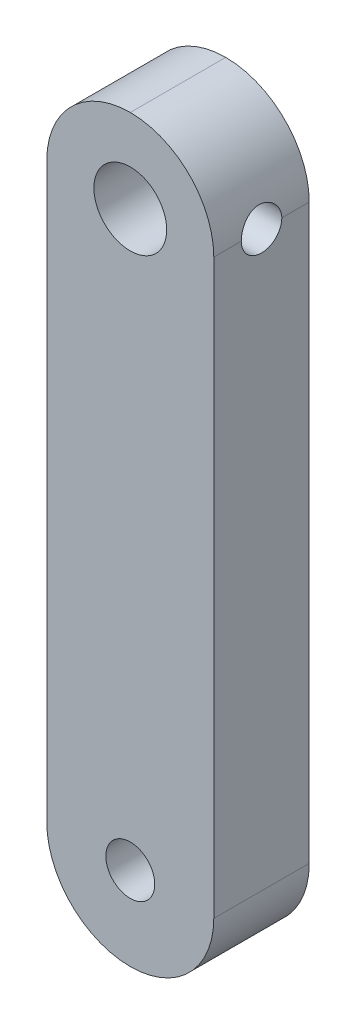
ISO-10303-21;
HEADER;
FILE_DESCRIPTION(('STEP AP214'),'2;1');
FILE_NAME('part.step','',(''),(''),'','','');
FILE_SCHEMA(('AUTOMOTIVE_DESIGN { 1 0 10303 214 1 1 1 1 }'));
ENDSEC;
DATA;
#1=APPLICATION_CONTEXT('core data for automotive mechanical design processes');
#2=APPLICATION_PROTOCOL_DEFINITION('international standard','automotive_design',2000,#1);
#3=PRODUCT_CONTEXT('',#1,'mechanical');
#4=PRODUCT('Part','Part','',(#3));
#5=PRODUCT_RELATED_PRODUCT_CATEGORY('part','',(#4));
#6=PRODUCT_DEFINITION_FORMATION('','',#4);
#7=PRODUCT_DEFINITION_CONTEXT('part definition',#1,'design');
#8=PRODUCT_DEFINITION('design','',#6,#7);
#9=PRODUCT_DEFINITION_SHAPE('','',#8);
#10=(LENGTH_UNIT() NAMED_UNIT(*) SI_UNIT(.MILLI.,.METRE.));
#11=(NAMED_UNIT(*) PLANE_ANGLE_UNIT() SI_UNIT($,.RADIAN.));
#12=(NAMED_UNIT(*) SI_UNIT($,.STERADIAN.) SOLID_ANGLE_UNIT());
#13=UNCERTAINTY_MEASURE_WITH_UNIT(LENGTH_MEASURE(1.E-05),#10,'distance_accuracy_value','');
#14=(GEOMETRIC_REPRESENTATION_CONTEXT(3) GLOBAL_UNCERTAINTY_ASSIGNED_CONTEXT((#13)) GLOBAL_UNIT_ASSIGNED_CONTEXT((#10,
#11,#12)) REPRESENTATION_CONTEXT('',''));
#15=CARTESIAN_POINT('',(0.,0.,0.));
#16=DIRECTION('',(0.,0.,1.));
#17=DIRECTION('',(1.,0.,0.));
#18=AXIS2_PLACEMENT_3D('',#15,#16,#17);
#19=CARTESIAN_POINT('',(0.,0.,8.));
#20=DIRECTION('',(1.,0.,0.));
#21=DIRECTION('',(0.,0.,-1.));
#22=AXIS2_PLACEMENT_3D('',#19,#20,#21);
#23=PLANE('',#22);
#24=DIRECTION('',(0.,-1.,0.));
#25=VECTOR('',#24,1.);
#26=CARTESIAN_POINT('',(0.,0.,0.));
#27=LINE('',#26,#25);
#28=CARTESIAN_POINT('',(0.,55.,0.));
#29=VERTEX_POINT('',#28);
#30=CARTESIAN_POINT('',(0.,7.,0.));
#31=VERTEX_POINT('',#30);
#32=EDGE_CURVE('E206',#29,#31,#27,.T.);
#33=ORIENTED_EDGE('',*,*,#32,.T.);
#34=DIRECTION('',(0.,0.,-1.));
#35=VECTOR('',#34,1.);
#36=CARTESIAN_POINT('',(0.,7.,8.));
#37=LINE('',#36,#35);
#38=CARTESIAN_POINT('',(0.,7.,8.));
#39=VERTEX_POINT('',#38);
#40=EDGE_CURVE('E11',#31,#39,#37,.F.);
#41=ORIENTED_EDGE('',*,*,#40,.T.);
#42=DIRECTION('',(0.,-1.,0.));
#43=VECTOR('',#42,1.);
#44=CARTESIAN_POINT('',(0.,0.,8.));
#45=LINE('',#44,#43);
#46=CARTESIAN_POINT('',(0.,55.,8.));
#47=VERTEX_POINT('',#46);
#48=EDGE_CURVE('E110',#47,#39,#45,.T.);
#49=ORIENTED_EDGE('',*,*,#48,.F.);
#50=DIRECTION('',(0.,0.,-1.));
#51=VECTOR('',#50,1.);
#52=CARTESIAN_POINT('',(0.,55.,8.));
#53=LINE('',#52,#51);
#54=EDGE_CURVE('E42',#47,#29,#53,.T.);
#55=ORIENTED_EDGE('',*,*,#54,.T.);
#56=EDGE_LOOP('',(#33,#41,#49,#55));
#57=FACE_BOUND('',#56,.T.);
#58=ADVANCED_FACE('F33',(#57),#23,.F.);
#59=CARTESIAN_POINT('',(14.,0.,8.));
#60=DIRECTION('',(-1.,0.,0.));
#61=DIRECTION('',(0.,0.,1.));
#62=AXIS2_PLACEMENT_3D('',#59,#60,#61);
#63=PLANE('',#62);
#64=DIRECTION('',(0.,0.,-1.));
#65=VECTOR('',#64,1.);
#66=CARTESIAN_POINT('',(14.,55.,8.));
#67=LINE('',#66,#65);
#68=CARTESIAN_POINT('',(14.,55.,0.));
#69=VERTEX_POINT('',#68);
#70=CARTESIAN_POINT('',(14.,55.,2.3));
#71=VERTEX_POINT('',#70);
#72=EDGE_CURVE('E104',#69,#71,#67,.F.);
#73=ORIENTED_EDGE('',*,*,#72,.T.);
#74=CARTESIAN_POINT('',(14.,55.,4.));
#75=DIRECTION('',(1.,0.,0.));
#76=DIRECTION('',(0.,0.,-1.));
#77=AXIS2_PLACEMENT_3D('',#74,#75,#76);
#78=CIRCLE('',#77,1.7);
#79=CARTESIAN_POINT('',(14.,55.,5.7));
#80=VERTEX_POINT('',#79);
#81=EDGE_CURVE('E49',#80,#71,#78,.T.);
#82=ORIENTED_EDGE('',*,*,#81,.F.);
#83=CARTESIAN_POINT('',(14.,55.,8.));
#84=VERTEX_POINT('',#83);
#85=EDGE_CURVE('E102',#80,#84,#67,.F.);
#86=ORIENTED_EDGE('',*,*,#85,.T.);
#87=DIRECTION('',(0.,1.,0.));
#88=VECTOR('',#87,1.);
#89=CARTESIAN_POINT('',(14.,0.,8.));
#90=LINE('',#89,#88);
#91=CARTESIAN_POINT('',(14.,7.,8.));
#92=VERTEX_POINT('',#91);
#93=EDGE_CURVE('E107',#92,#84,#90,.T.);
#94=ORIENTED_EDGE('',*,*,#93,.F.);
#95=DIRECTION('',(0.,0.,-1.));
#96=VECTOR('',#95,1.);
#97=CARTESIAN_POINT('',(14.,7.,8.));
#98=LINE('',#97,#96);
#99=CARTESIAN_POINT('',(14.,7.,0.));
#100=VERTEX_POINT('',#99);
#101=EDGE_CURVE('E109',#92,#100,#98,.T.);
#102=ORIENTED_EDGE('',*,*,#101,.T.);
#103=DIRECTION('',(0.,1.,0.));
#104=VECTOR('',#103,1.);
#105=CARTESIAN_POINT('',(14.,0.,0.));
#106=LINE('',#105,#104);
#107=EDGE_CURVE('E114',#100,#69,#106,.T.);
#108=ORIENTED_EDGE('',*,*,#107,.T.);
#109=EDGE_LOOP('',(#73,#82,#86,#94,#102,#108));
#110=FACE_BOUND('',#109,.T.);
#111=ADVANCED_FACE('F100',(#110),#63,.F.);
#112=CARTESIAN_POINT('',(0.,0.,8.));
#113=DIRECTION('',(0.,0.,-1.));
#114=DIRECTION('',(-1.,0.,0.));
#115=AXIS2_PLACEMENT_3D('',#112,#113,#114);
#116=PLANE('',#115);
#117=CARTESIAN_POINT('',(7.,55.,8.));
#118=DIRECTION('',(0.,0.,-1.));
#119=DIRECTION('',(-1.,0.,0.));
#120=AXIS2_PLACEMENT_3D('',#117,#118,#119);
#121=CIRCLE('',#120,3.05);
#122=CARTESIAN_POINT('',(3.95,55.,8.));
#123=VERTEX_POINT('',#122);
#124=EDGE_CURVE('E208',#123,#123,#121,.T.);
#125=ORIENTED_EDGE('',*,*,#124,.T.);
#126=EDGE_LOOP('',(#125));
#127=FACE_BOUND('',#126,.T.);
#128=CARTESIAN_POINT('',(7.,7.,8.));
#129=DIRECTION('',(0.,0.,-1.));
#130=DIRECTION('',(-1.,0.,0.));
#131=AXIS2_PLACEMENT_3D('',#128,#129,#130);
#132=CIRCLE('',#131,2.05);
#133=CARTESIAN_POINT('',(4.95,7.,8.));
#134=VERTEX_POINT('',#133);
#135=EDGE_CURVE('E211',#134,#134,#132,.T.);
#136=ORIENTED_EDGE('',*,*,#135,.T.);
#137=EDGE_LOOP('',(#136));
#138=FACE_BOUND('',#137,.T.);
#139=CARTESIAN_POINT('',(7.,7.,8.));
#140=DIRECTION('',(0.,0.,-1.));
#141=DIRECTION('',(-1.,0.,0.));
#142=AXIS2_PLACEMENT_3D('',#139,#140,#141);
#143=CIRCLE('',#142,7.);
#144=CARTESIAN_POINT('',(7.,0.,8.));
#145=VERTEX_POINT('',#144);
#146=EDGE_CURVE('E129',#39,#145,#143,.F.);
#147=ORIENTED_EDGE('',*,*,#146,.T.);
#148=CARTESIAN_POINT('',(7.,7.,8.));
#149=DIRECTION('',(0.,0.,-1.));
#150=DIRECTION('',(-1.,0.,0.));
#151=AXIS2_PLACEMENT_3D('',#148,#149,#150);
#152=CIRCLE('',#151,7.);
#153=EDGE_CURVE('E131',#145,#92,#152,.F.);
#154=ORIENTED_EDGE('',*,*,#153,.T.);
#155=ORIENTED_EDGE('',*,*,#93,.T.);
#156=CARTESIAN_POINT('',(7.,55.,8.));
#157=DIRECTION('',(0.,0.,-1.));
#158=DIRECTION('',(-1.,0.,0.));
#159=AXIS2_PLACEMENT_3D('',#156,#157,#158);
#160=CIRCLE('',#159,7.);
#161=CARTESIAN_POINT('',(7.,62.,8.));
#162=VERTEX_POINT('',#161);
#163=EDGE_CURVE('E57',#84,#162,#160,.F.);
#164=ORIENTED_EDGE('',*,*,#163,.T.);
#165=CARTESIAN_POINT('',(7.,55.,8.));
#166=DIRECTION('',(0.,0.,-1.));
#167=DIRECTION('',(-1.,0.,0.));
#168=AXIS2_PLACEMENT_3D('',#165,#166,#167);
#169=CIRCLE('',#168,7.);
#170=EDGE_CURVE('E127',#162,#47,#169,.F.);
#171=ORIENTED_EDGE('',*,*,#170,.T.);
#172=ORIENTED_EDGE('',*,*,#48,.T.);
#173=EDGE_LOOP('',(#147,#154,#155,#164,#171,#172));
#174=FACE_BOUND('',#173,.T.);
#175=ADVANCED_FACE('F177',(#127,#138,#174),#116,.F.);
#176=CARTESIAN_POINT('',(0.,0.,0.));
#177=DIRECTION('',(0.,0.,-1.));
#178=DIRECTION('',(-1.,0.,0.));
#179=AXIS2_PLACEMENT_3D('',#176,#177,#178);
#180=PLANE('',#179);
#181=CARTESIAN_POINT('',(7.,55.,0.));
#182=DIRECTION('',(0.,0.,1.));
#183=DIRECTION('',(1.,0.,0.));
#184=AXIS2_PLACEMENT_3D('',#181,#182,#183);
#185=CIRCLE('',#184,3.05);
#186=CARTESIAN_POINT('',(10.05,55.,0.));
#187=VERTEX_POINT('',#186);
#188=EDGE_CURVE('E141',#187,#187,#185,.T.);
#189=ORIENTED_EDGE('',*,*,#188,.T.);
#190=EDGE_LOOP('',(#189));
#191=FACE_BOUND('',#190,.T.);
#192=CARTESIAN_POINT('',(7.,7.,0.));
#193=DIRECTION('',(0.,0.,1.));
#194=DIRECTION('',(-1.,0.,0.));
#195=AXIS2_PLACEMENT_3D('',#192,#193,#194);
#196=CIRCLE('',#195,2.05);
#197=CARTESIAN_POINT('',(4.95,7.,0.));
#198=VERTEX_POINT('',#197);
#199=EDGE_CURVE('E136',#198,#198,#196,.T.);
#200=ORIENTED_EDGE('',*,*,#199,.T.);
#201=EDGE_LOOP('',(#200));
#202=FACE_BOUND('',#201,.T.);
#203=ORIENTED_EDGE('',*,*,#107,.F.);
#204=CARTESIAN_POINT('',(7.,7.,0.));
#205=DIRECTION('',(0.,0.,-1.));
#206=DIRECTION('',(-1.,0.,0.));
#207=AXIS2_PLACEMENT_3D('',#204,#205,#206);
#208=CIRCLE('',#207,7.);
#209=CARTESIAN_POINT('',(7.,0.,0.));
#210=VERTEX_POINT('',#209);
#211=EDGE_CURVE('E124',#100,#210,#208,.T.);
#212=ORIENTED_EDGE('',*,*,#211,.T.);
#213=CARTESIAN_POINT('',(7.,7.,0.));
#214=DIRECTION('',(0.,0.,-1.));
#215=DIRECTION('',(-1.,0.,0.));
#216=AXIS2_PLACEMENT_3D('',#213,#214,#215);
#217=CIRCLE('',#216,7.);
#218=EDGE_CURVE('E122',#210,#31,#217,.T.);
#219=ORIENTED_EDGE('',*,*,#218,.T.);
#220=ORIENTED_EDGE('',*,*,#32,.F.);
#221=CARTESIAN_POINT('',(7.,55.,0.));
#222=DIRECTION('',(0.,0.,-1.));
#223=DIRECTION('',(-1.,0.,0.));
#224=AXIS2_PLACEMENT_3D('',#221,#222,#223);
#225=CIRCLE('',#224,7.);
#226=CARTESIAN_POINT('',(7.,62.,0.));
#227=VERTEX_POINT('',#226);
#228=EDGE_CURVE('E120',#29,#227,#225,.T.);
#229=ORIENTED_EDGE('',*,*,#228,.T.);
#230=CARTESIAN_POINT('',(7.,55.,0.));
#231=DIRECTION('',(0.,0.,-1.));
#232=DIRECTION('',(-1.,0.,0.));
#233=AXIS2_PLACEMENT_3D('',#230,#231,#232);
#234=CIRCLE('',#233,7.);
#235=EDGE_CURVE('E118',#227,#69,#234,.T.);
#236=ORIENTED_EDGE('',*,*,#235,.T.);
#237=EDGE_LOOP('',(#203,#212,#219,#220,#229,#236));
#238=FACE_BOUND('',#237,.T.);
#239=ADVANCED_FACE('F175',(#191,#202,#238),#180,.T.);
#240=CARTESIAN_POINT('',(7.,7.,0.));
#241=DIRECTION('',(0.,0.,1.));
#242=DIRECTION('',(1.,0.,0.));
#243=AXIS2_PLACEMENT_3D('',#240,#241,#242);
#244=CYLINDRICAL_SURFACE('',#243,2.05);
#245=ORIENTED_EDGE('',*,*,#199,.F.);
#246=EDGE_LOOP('',(#245));
#247=FACE_BOUND('',#246,.T.);
#248=ORIENTED_EDGE('',*,*,#135,.F.);
#249=EDGE_LOOP('',(#248));
#250=FACE_BOUND('',#249,.T.);
#251=ADVANCED_FACE('F171',(#247,#250),#244,.F.);
#252=CARTESIAN_POINT('',(7.,55.,0.));
#253=DIRECTION('',(0.,0.,1.));
#254=DIRECTION('',(1.,0.,0.));
#255=AXIS2_PLACEMENT_3D('',#252,#253,#254);
#256=CYLINDRICAL_SURFACE('',#255,3.05);
#257=CARTESIAN_POINT('',(10.05,55.,2.30000000000001));
#258=CARTESIAN_POINT('',(10.0500025068202,54.911805564847,2.29999709787084));
#259=CARTESIAN_POINT('',(10.0461422018317,54.8236279012857,2.30689300682584));
#260=CARTESIAN_POINT('',(10.0311062898428,54.6500159722376,2.33409683706801));
#261=CARTESIAN_POINT('',(10.0199295053791,54.5645821506478,2.35440691714338));
#262=CARTESIAN_POINT('',(9.9914013311896,54.3991256163347,2.40736849927434));
#263=CARTESIAN_POINT('',(9.97407266578181,54.3190842620997,2.43997460848473));
#264=CARTESIAN_POINT('',(9.93475951742604,54.1657582426484,2.51629449537056));
#265=CARTESIAN_POINT('',(9.91277390657176,54.0924752204747,2.5600109644746));
#266=CARTESIAN_POINT('',(9.86427137246103,53.9490115748959,2.66073349707421));
#267=CARTESIAN_POINT('',(9.83754524126336,53.8794048753229,2.71845436832591));
#268=CARTESIAN_POINT('',(9.7831081742802,53.750309231775,2.84397618569085));
#269=CARTESIAN_POINT('',(9.75539625927459,53.6908307081829,2.91178738047254));
#270=CARTESIAN_POINT('',(9.69879964247354,53.5775426347645,3.06378653019544));
#271=CARTESIAN_POINT('',(9.67008442713598,53.5249332958416,3.14893985618241));
#272=CARTESIAN_POINT('',(9.61839945615896,53.4350110858907,3.3285418579093));
#273=CARTESIAN_POINT('',(9.59542144349166,53.397676181742,3.42297689913278));
#274=CARTESIAN_POINT('',(9.56288241747853,53.3462599941083,3.59798693805679));
#275=CARTESIAN_POINT('',(9.55151189376901,53.3289313034848,3.67727134669565));
#276=CARTESIAN_POINT('',(9.5361978397784,53.3057738136396,3.83817692241018));
#277=CARTESIAN_POINT('',(9.532246919364,53.299933571325,3.91979568203234));
#278=CARTESIAN_POINT('',(9.53233681627798,53.3000676663281,4.08310742952568));
#279=CARTESIAN_POINT('',(9.53638661707387,53.3060552843476,4.16480039777206));
#280=CARTESIAN_POINT('',(9.55190339634783,53.3295272729208,4.32580665691397));
#281=CARTESIAN_POINT('',(9.56337522873334,53.3470191672384,4.40511835494699));
#282=CARTESIAN_POINT('',(9.59223397108078,53.3926597162579,4.55940547299726));
#283=CARTESIAN_POINT('',(9.6096196105207,53.4208060821001,4.63438182037638));
#284=CARTESIAN_POINT('',(9.64842803344615,53.4867943680412,4.77879369243187));
#285=CARTESIAN_POINT('',(9.66985238979477,53.5246400675804,4.84822704336225));
#286=CARTESIAN_POINT('',(9.71829366221531,53.6156511896593,4.99085158938562));
#287=CARTESIAN_POINT('',(9.74566479473654,53.6702742979711,5.06299377968949));
#288=CARTESIAN_POINT('',(9.80058965023019,53.7902254271237,5.19774467603501));
#289=CARTESIAN_POINT('',(9.82814350172713,53.8555619746161,5.26034571122624));
#290=CARTESIAN_POINT('',(9.88368650111466,54.0031637446999,5.3806824109216));
#291=CARTESIAN_POINT('',(9.9114294273173,54.0864786253782,5.43725708522256));
#292=CARTESIAN_POINT('',(9.96107075742639,54.2631451727145,5.53532738243484));
#293=CARTESIAN_POINT('',(9.98297299172505,54.3564902048456,5.57683289436314));
#294=CARTESIAN_POINT('',(10.0170692482207,54.5437179294888,5.64038809926508));
#295=CARTESIAN_POINT('',(10.0298405230333,54.6370952765443,5.66360659385402));
#296=CARTESIAN_POINT('',(10.0465888724466,54.8271754506448,5.69392139316057));
#297=CARTESIAN_POINT('',(10.050573813321,54.9238752243201,5.70103211907948));
#298=CARTESIAN_POINT('',(10.0493629187184,55.1059227170893,5.69885466553669));
#299=CARTESIAN_POINT('',(10.0451639486229,55.1913052096332,5.69134720383023));
#300=CARTESIAN_POINT('',(10.0299289319272,55.3593730022783,5.66376136476098));
#301=CARTESIAN_POINT('',(10.0188926741599,55.4420582189921,5.64368259913797));
#302=CARTESIAN_POINT('',(9.99105112175122,55.6022480643665,5.59196640247648));
#303=CARTESIAN_POINT('',(9.97427129197614,55.6797737861584,5.56037995310509));
#304=CARTESIAN_POINT('',(9.93631969657002,55.8285080743968,5.48676392808037));
#305=CARTESIAN_POINT('',(9.91514676957963,55.8997149632753,5.44473159036932));
#306=CARTESIAN_POINT('',(9.86767116883303,56.0416944309632,5.34650500458352));
#307=CARTESIAN_POINT('',(9.84106456090525,56.1116629992209,5.28929660497719));
#308=CARTESIAN_POINT('',(9.78675959051118,56.241546586422,5.16476221019413));
#309=CARTESIAN_POINT('',(9.75906004672145,56.3014503373946,5.09742503312793));
#310=CARTESIAN_POINT('',(9.70236733049411,56.4156894165932,4.94640377043474));
#311=CARTESIAN_POINT('',(9.67353023786792,56.4688341645389,4.86175296975687));
#312=CARTESIAN_POINT('',(9.62142638164466,56.5599336290677,4.68309839508369));
#313=CARTESIAN_POINT('',(9.59815179995994,56.5979097161774,4.58910801421829));
#314=CARTESIAN_POINT('',(9.56488430403229,56.6506452779735,4.41455650761121));
#315=CARTESIAN_POINT('',(9.55313191080258,56.668598744071,4.33529620974938));
#316=CARTESIAN_POINT('',(9.53702570625984,56.692992458671,4.1743160106459));
#317=CARTESIAN_POINT('',(9.53266438828117,56.6994443889301,4.09259869083132));
#318=CARTESIAN_POINT('',(9.53196434300628,56.7004873478707,3.9289466082533));
#319=CARTESIAN_POINT('',(9.53563625681314,56.6950626443357,3.84701170084255));
#320=CARTESIAN_POINT('',(9.55048343750954,56.6726348547075,3.68542700320314));
#321=CARTESIAN_POINT('',(9.56166349918906,56.6556243697018,3.60577870714491));
#322=CARTESIAN_POINT('',(9.58998399510739,56.6109530737435,3.45110312632255));
#323=CARTESIAN_POINT('',(9.60709711420271,56.5833410097545,3.37605648802113));
#324=CARTESIAN_POINT('',(9.6454343422788,56.5184187005633,3.2314325765619));
#325=CARTESIAN_POINT('',(9.6666600272548,56.4811047355706,3.16185741456954));
#326=CARTESIAN_POINT('',(9.71472268313175,56.3913105775918,3.01897495400871));
#327=CARTESIAN_POINT('',(9.74192284477506,56.337390369435,2.94669364381675));
#328=CARTESIAN_POINT('',(9.79662390184001,56.2188764301101,2.81154364318016));
#329=CARTESIAN_POINT('',(9.82412502396357,56.1542740494201,2.74868265980194));
#330=CARTESIAN_POINT('',(9.87979471494185,56.0079840822617,2.62744037433947));
#331=CARTESIAN_POINT('',(9.90772313724182,55.9252101044046,2.57024675009398));
#332=CARTESIAN_POINT('',(9.95787281352009,55.7495388829955,2.47083184923837));
#333=CARTESIAN_POINT('',(9.98009792199662,55.6566485372334,2.42860045324695));
#334=CARTESIAN_POINT('',(10.0147644679442,55.4710423769577,2.36384899917078));
#335=CARTESIAN_POINT('',(10.0278453191795,55.3789046511931,2.34002447659093));
#336=CARTESIAN_POINT('',(10.0454581953296,55.1911694348109,2.30810804883581));
#337=CARTESIAN_POINT('',(10.0499972833998,55.0955748693758,2.30000314499));
#338=CARTESIAN_POINT('',(10.05,55.,2.30000000000001));
#339=B_SPLINE_CURVE_WITH_KNOTS('',3,(#257,#258,#259,#260,#261,#262,#263,#264,#265,#266,#267,
#268,#269,#270,#271,#272,#273,#274,#275,#276,#277,#278,#279,#280,#281,#282,#283,#284,#285,#286,
#287,#288,#289,#290,#291,#292,#293,#294,#295,#296,#297,#298,#299,#300,#301,#302,#303,#304,#305,
#306,#307,#308,#309,#310,#311,#312,#313,#314,#315,#316,#317,#318,#319,#320,#321,#322,#323,#324,
#325,#326,#327,#328,#329,#330,#331,#332,#333,#334,#335,#336,#337,#338),.UNSPECIFIED.,.T.,.F.,(4,
2,2,2,2,2,2,2,2,2,2,2,2,2,2,2,2,2,2,2,2,2,2,2,2,2,2,2,2,2,2,2,2,2,2,2,2,2,2,2,4),(0.,
0.264212805897031,0.528468142823787,0.791757338223033,1.0551103749963,1.33685214062525,
1.618882047716,1.92972905275297,2.24012607157898,2.48490154029561,2.72943307619397,
2.97423933603178,3.21920585788055,3.46411978433909,3.70912928939344,3.9916054838128,
4.274307597475,4.58605988885702,4.89760722392025,5.18711118910638,5.47635586029,5.7325551194121,
5.98876229154681,6.24384794189954,6.49900111282047,6.78049990283164,7.06231177201665,
7.37285835185224,7.68296585847714,7.92823753698059,8.17325995833324,8.41860714155016,
8.66411115549488,8.90849958440277,9.15298185241685,9.4344255876663,9.7160983383994,
10.0277314948144,10.3391534806833,10.6257136444281,10.9120367482294),.UNSPECIFIED.);
#340=CARTESIAN_POINT('',(10.05,55.,2.30000000000001));
#341=VERTEX_POINT('',#340);
#342=EDGE_CURVE('E105',#341,#341,#339,.T.);
#343=ORIENTED_EDGE('',*,*,#342,.F.);
#344=EDGE_LOOP('',(#343));
#345=FACE_BOUND('',#344,.T.);
#346=ORIENTED_EDGE('',*,*,#188,.F.);
#347=EDGE_LOOP('',(#346));
#348=FACE_BOUND('',#347,.T.);
#349=ORIENTED_EDGE('',*,*,#124,.F.);
#350=EDGE_LOOP('',(#349));
#351=FACE_BOUND('',#350,.T.);
#352=ADVANCED_FACE('F166',(#345,#348,#351),#256,.F.);
#353=CARTESIAN_POINT('',(7.,7.,8.));
#354=DIRECTION('',(0.,0.,-1.));
#355=DIRECTION('',(-1.,0.,0.));
#356=AXIS2_PLACEMENT_3D('',#353,#354,#355);
#357=CYLINDRICAL_SURFACE('',#356,7.);
#358=DIRECTION('',(0.,0.,-1.));
#359=VECTOR('',#358,1.);
#360=CARTESIAN_POINT('',(7.,0.,8.));
#361=LINE('',#360,#359);
#362=EDGE_CURVE('E134',#145,#210,#361,.T.);
#363=ORIENTED_EDGE('',*,*,#362,.F.);
#364=ORIENTED_EDGE('',*,*,#146,.F.);
#365=ORIENTED_EDGE('',*,*,#40,.F.);
#366=ORIENTED_EDGE('',*,*,#218,.F.);
#367=EDGE_LOOP('',(#363,#364,#365,#366));
#368=FACE_BOUND('',#367,.T.);
#369=ADVANCED_FACE('F170',(#368),#357,.T.);
#370=CARTESIAN_POINT('',(7.,7.,8.));
#371=DIRECTION('',(0.,0.,-1.));
#372=DIRECTION('',(-1.,0.,0.));
#373=AXIS2_PLACEMENT_3D('',#370,#371,#372);
#374=CYLINDRICAL_SURFACE('',#373,7.);
#375=ORIENTED_EDGE('',*,*,#153,.F.);
#376=ORIENTED_EDGE('',*,*,#362,.T.);
#377=ORIENTED_EDGE('',*,*,#211,.F.);
#378=ORIENTED_EDGE('',*,*,#101,.F.);
#379=EDGE_LOOP('',(#375,#376,#377,#378));
#380=FACE_BOUND('',#379,.T.);
#381=ADVANCED_FACE('F189',(#380),#374,.T.);
#382=CARTESIAN_POINT('',(7.,55.,8.));
#383=DIRECTION('',(0.,0.,-1.));
#384=DIRECTION('',(-1.,0.,0.));
#385=AXIS2_PLACEMENT_3D('',#382,#383,#384);
#386=CYLINDRICAL_SURFACE('',#385,7.);
#387=CARTESIAN_POINT('',(14.,55.,5.7));
#388=CARTESIAN_POINT('',(14.0000026133346,55.0470933369308,5.70000046775027));
#389=CARTESIAN_POINT('',(13.9995241779389,55.094163465471,5.69804188326621));
#390=CARTESIAN_POINT('',(13.997633025373,55.1879539345403,5.69023345562524));
#391=CARTESIAN_POINT('',(13.9962204482074,55.2346743264252,5.68438419558371));
#392=CARTESIAN_POINT('',(13.9906331540311,55.3736245258947,5.66108214611104));
#393=CARTESIAN_POINT('',(13.985108573086,55.4649029789487,5.63787474351297));
#394=CARTESIAN_POINT('',(13.971054403699,55.6421268150685,5.57685464398214));
#395=CARTESIAN_POINT('',(13.9625248497487,55.7280722593342,5.5390421146888));
#396=CARTESIAN_POINT('',(13.9433721901867,55.8924299942239,5.44993303510488));
#397=CARTESIAN_POINT('',(13.932748643924,55.9708406940921,5.39863364593471));
#398=CARTESIAN_POINT('',(13.9103345154854,56.1193867240976,5.28296140767685));
#399=CARTESIAN_POINT('',(13.8985268609034,56.1893545664314,5.21837686138929));
#400=CARTESIAN_POINT('',(13.8751890647662,56.3175857206212,5.07841446511836));
#401=CARTESIAN_POINT('',(13.8636589744124,56.3758468873277,5.00303464131778));
#402=CARTESIAN_POINT('',(13.8420104653584,56.4797836947534,4.84233135692485));
#403=CARTESIAN_POINT('',(13.8319139199712,56.5252729485573,4.75688413815644));
#404=CARTESIAN_POINT('',(13.8145260129952,56.6011750634777,4.57927559390802));
#405=CARTESIAN_POINT('',(13.8072340849791,56.6315909692015,4.48711562862679));
#406=CARTESIAN_POINT('',(13.7964566070813,56.6759155760578,4.3005415503747));
#407=CARTESIAN_POINT('',(13.7929015148384,56.6901262969764,4.20620329729875));
#408=CARTESIAN_POINT('',(13.7897918918586,56.7025776190895,4.01641776779832));
#409=CARTESIAN_POINT('',(13.7902368398514,56.7008203011789,3.92097063749756));
#410=CARTESIAN_POINT('',(13.7950145522465,56.6816262892448,3.73397919304973));
#411=CARTESIAN_POINT('',(13.7992585234799,56.6645476745194,3.64239550272809));
#412=CARTESIAN_POINT('',(13.811014806789,56.615766318135,3.46343442966276));
#413=CARTESIAN_POINT('',(13.8185273115386,56.5840627143532,3.37605729522509));
#414=CARTESIAN_POINT('',(13.8360572393697,56.506620175804,3.207016422331));
#415=CARTESIAN_POINT('',(13.8460980459089,56.4607492610292,3.12541567469433));
#416=CARTESIAN_POINT('',(13.867539426455,56.3563675773081,2.97094236319669));
#417=CARTESIAN_POINT('',(13.8789401921518,56.2978550255435,2.89807103267906));
#418=CARTESIAN_POINT('',(13.9021913970549,56.1679946615869,2.76107624229702));
#419=CARTESIAN_POINT('',(13.914045708227,56.0963454458313,2.69723884040861));
#420=CARTESIAN_POINT('',(13.9365956967364,55.9431968228051,2.58241792138892));
#421=CARTESIAN_POINT('',(13.9472910738922,55.8616948750381,2.53143772995202));
#422=CARTESIAN_POINT('',(13.9663684373024,55.6907480686555,2.44367862593661));
#423=CARTESIAN_POINT('',(13.9747418952254,55.6012754826078,2.40695187354235));
#424=CARTESIAN_POINT('',(13.9881604998906,55.4172316754242,2.34918573045896));
#425=CARTESIAN_POINT('',(13.9932105246743,55.3226681483333,2.32812334211969));
#426=CARTESIAN_POINT('',(13.997539403866,55.1894140795633,2.31015578092037));
#427=CARTESIAN_POINT('',(13.9984609556398,55.1516052112921,2.30634652035399));
#428=CARTESIAN_POINT('',(13.9996908855945,55.0758701596327,2.30127157734001));
#429=CARTESIAN_POINT('',(14.000000277464,55.0379442745211,2.30000168985314));
#430=CARTESIAN_POINT('',(14.,55.,2.29999999999999));
#431=B_SPLINE_CURVE_WITH_KNOTS('',3,(#387,#388,#389,#390,#391,#392,#393,#394,#395,#396,#397,
#398,#399,#400,#401,#402,#403,#404,#405,#406,#407,#408,#409,#410,#411,#412,#413,#414,#415,#416,
#417,#418,#419,#420,#421,#422,#423,#424,#425,#426,#427,#428,#429,#430),.UNSPECIFIED.,.F.,.F.,(4,
2,2,2,2,2,2,2,2,2,2,2,2,2,2,2,2,2,2,2,2,4),(0.,0.141191143686534,0.282361131103659,
0.563932374262592,0.845500385608283,1.12712771235845,1.4136491280244,1.70022299853941,
1.99078410821435,2.28128650462705,2.56628140802131,2.85123917248267,3.12970575840557,
3.40818876164466,3.68934857502342,3.97054806557844,4.25926760665108,4.54806175258637,
4.8379029881213,5.12731784837292,5.2412804602637,5.35505420057015),.UNSPECIFIED.);
#432=EDGE_CURVE('E91',#80,#71,#431,.T.);
#433=ORIENTED_EDGE('',*,*,#432,.T.);
#434=ORIENTED_EDGE('',*,*,#72,.F.);
#435=ORIENTED_EDGE('',*,*,#235,.F.);
#436=DIRECTION('',(0.,0.,-1.));
#437=VECTOR('',#436,1.);
#438=CARTESIAN_POINT('',(7.,62.,8.));
#439=LINE('',#438,#437);
#440=EDGE_CURVE('E37',#162,#227,#439,.T.);
#441=ORIENTED_EDGE('',*,*,#440,.F.);
#442=ORIENTED_EDGE('',*,*,#163,.F.);
#443=ORIENTED_EDGE('',*,*,#85,.F.);
#444=EDGE_LOOP('',(#433,#434,#435,#441,#442,#443));
#445=FACE_BOUND('',#444,.T.);
#446=ADVANCED_FACE('F35',(#445),#386,.T.);
#447=CARTESIAN_POINT('',(7.,55.,8.));
#448=DIRECTION('',(0.,0.,-1.));
#449=DIRECTION('',(-1.,0.,0.));
#450=AXIS2_PLACEMENT_3D('',#447,#448,#449);
#451=CYLINDRICAL_SURFACE('',#450,7.);
#452=ORIENTED_EDGE('',*,*,#170,.F.);
#453=ORIENTED_EDGE('',*,*,#440,.T.);
#454=ORIENTED_EDGE('',*,*,#228,.F.);
#455=ORIENTED_EDGE('',*,*,#54,.F.);
#456=EDGE_LOOP('',(#452,#453,#454,#455));
#457=FACE_BOUND('',#456,.T.);
#458=ADVANCED_FACE('F165',(#457),#451,.T.);
#459=CARTESIAN_POINT('',(-0.000999999999999265,55.,4.));
#460=DIRECTION('',(1.,0.,0.));
#461=DIRECTION('',(0.,0.,-1.));
#462=AXIS2_PLACEMENT_3D('',#459,#460,#461);
#463=CYLINDRICAL_SURFACE('',#462,1.7);
#464=ORIENTED_EDGE('',*,*,#81,.T.);
#465=ORIENTED_EDGE('',*,*,#432,.F.);
#466=EDGE_LOOP('',(#464,#465));
#467=FACE_BOUND('',#466,.T.);
#468=ORIENTED_EDGE('',*,*,#342,.T.);
#469=EDGE_LOOP('',(#468));
#470=FACE_BOUND('',#469,.T.);
#471=ADVANCED_FACE('F92',(#467,#470),#463,.F.);
#472=CLOSED_SHELL('',(#58,#111,#175,#239,#251,#352,#369,#381,#446,#458,#471));
#473=MANIFOLD_SOLID_BREP('B2',#472);
#474=ADVANCED_BREP_SHAPE_REPRESENTATION('',(#18,#473),#14);
#475=SHAPE_DEFINITION_REPRESENTATION(#9,#474);
ENDSEC;
END-ISO-10303-21;
